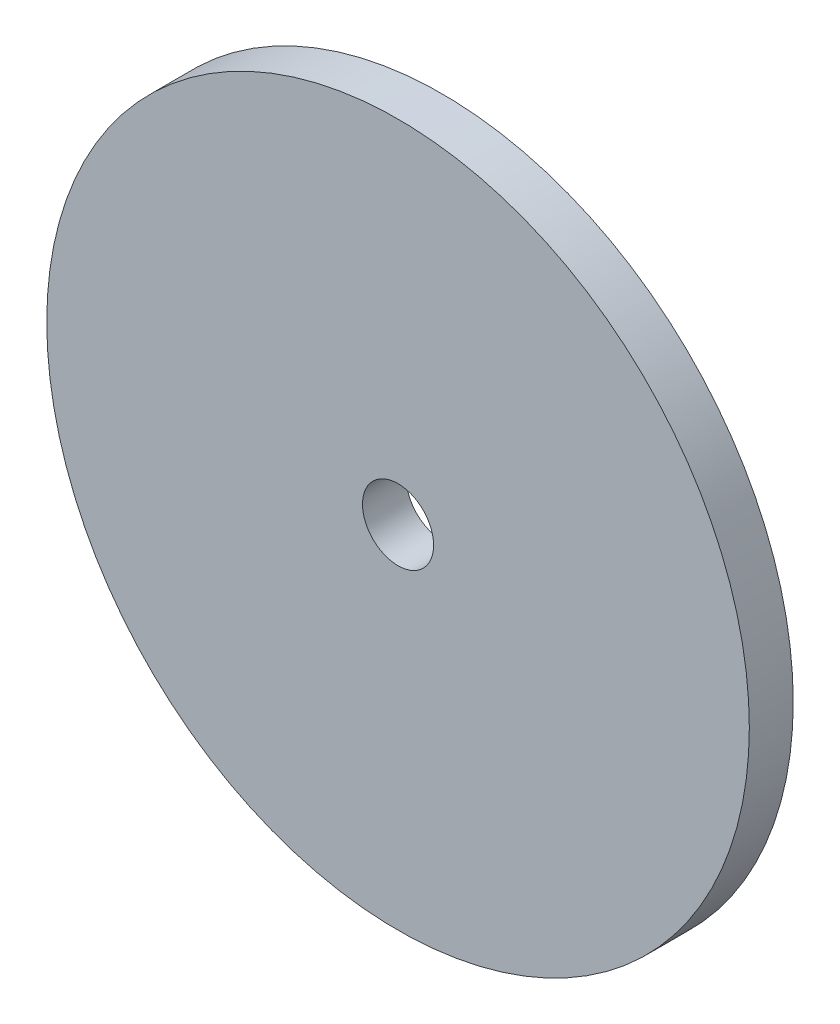
ISO-10303-21;
HEADER;
FILE_DESCRIPTION(('STEP AP214'),'2;1');
FILE_NAME('part.step','',(''),(''),'','','');
FILE_SCHEMA(('AUTOMOTIVE_DESIGN { 1 0 10303 214 1 1 1 1 }'));
ENDSEC;
DATA;
#1=APPLICATION_CONTEXT('core data for automotive mechanical design processes');
#2=APPLICATION_PROTOCOL_DEFINITION('international standard','automotive_design',2000,#1);
#3=PRODUCT_CONTEXT('',#1,'mechanical');
#4=PRODUCT('Part','Part','',(#3));
#5=PRODUCT_RELATED_PRODUCT_CATEGORY('part','',(#4));
#6=PRODUCT_DEFINITION_FORMATION('','',#4);
#7=PRODUCT_DEFINITION_CONTEXT('part definition',#1,'design');
#8=PRODUCT_DEFINITION('design','',#6,#7);
#9=PRODUCT_DEFINITION_SHAPE('','',#8);
#10=(LENGTH_UNIT() NAMED_UNIT(*) SI_UNIT(.MILLI.,.METRE.));
#11=(NAMED_UNIT(*) PLANE_ANGLE_UNIT() SI_UNIT($,.RADIAN.));
#12=(NAMED_UNIT(*) SI_UNIT($,.STERADIAN.) SOLID_ANGLE_UNIT());
#13=UNCERTAINTY_MEASURE_WITH_UNIT(LENGTH_MEASURE(1.E-05),#10,'distance_accuracy_value','');
#14=(GEOMETRIC_REPRESENTATION_CONTEXT(3) GLOBAL_UNCERTAINTY_ASSIGNED_CONTEXT((#13)) GLOBAL_UNIT_ASSIGNED_CONTEXT((#10,
#11,#12)) REPRESENTATION_CONTEXT('',''));
#15=CARTESIAN_POINT('',(0.,0.,0.));
#16=DIRECTION('',(0.,0.,1.));
#17=DIRECTION('',(1.,0.,0.));
#18=AXIS2_PLACEMENT_3D('',#15,#16,#17);
#19=CARTESIAN_POINT('',(0.,0.,5.));
#20=DIRECTION('',(0.,0.,1.));
#21=DIRECTION('',(1.,0.,0.));
#22=AXIS2_PLACEMENT_3D('',#19,#20,#21);
#23=PLANE('',#22);
#24=CARTESIAN_POINT('',(0.,0.,5.));
#25=DIRECTION('',(0.,0.,1.));
#26=DIRECTION('',(1.,0.,0.));
#27=AXIS2_PLACEMENT_3D('',#24,#25,#26);
#28=CIRCLE('',#27,40.);
#29=CARTESIAN_POINT('',(40.,0.,5.));
#30=VERTEX_POINT('',#29);
#31=EDGE_CURVE('E10',#30,#30,#28,.T.);
#32=ORIENTED_EDGE('',*,*,#31,.T.);
#33=EDGE_LOOP('',(#32));
#34=FACE_BOUND('',#33,.T.);
#35=CARTESIAN_POINT('',(0.,0.,5.));
#36=DIRECTION('',(0.,0.,1.));
#37=DIRECTION('',(1.,0.,0.));
#38=AXIS2_PLACEMENT_3D('',#35,#36,#37);
#39=CIRCLE('',#38,4.05);
#40=CARTESIAN_POINT('',(4.05,0.,5.));
#41=VERTEX_POINT('',#40);
#42=EDGE_CURVE('E46',#41,#41,#39,.T.);
#43=ORIENTED_EDGE('',*,*,#42,.F.);
#44=EDGE_LOOP('',(#43));
#45=FACE_BOUND('',#44,.T.);
#46=ADVANCED_FACE('F35',(#34,#45),#23,.T.);
#47=CARTESIAN_POINT('',(0.,0.,0.));
#48=DIRECTION('',(0.,0.,1.));
#49=DIRECTION('',(1.,0.,0.));
#50=AXIS2_PLACEMENT_3D('',#47,#48,#49);
#51=PLANE('',#50);
#52=CARTESIAN_POINT('',(0.,0.,0.));
#53=DIRECTION('',(0.,0.,1.));
#54=DIRECTION('',(1.,0.,0.));
#55=AXIS2_PLACEMENT_3D('',#52,#53,#54);
#56=CIRCLE('',#55,40.);
#57=CARTESIAN_POINT('',(40.,0.,0.));
#58=VERTEX_POINT('',#57);
#59=EDGE_CURVE('E39',#58,#58,#56,.T.);
#60=ORIENTED_EDGE('',*,*,#59,.F.);
#61=EDGE_LOOP('',(#60));
#62=FACE_BOUND('',#61,.T.);
#63=CARTESIAN_POINT('',(0.,0.,0.));
#64=DIRECTION('',(0.,0.,1.));
#65=DIRECTION('',(1.,0.,0.));
#66=AXIS2_PLACEMENT_3D('',#63,#64,#65);
#67=CIRCLE('',#66,4.05);
#68=CARTESIAN_POINT('',(4.05,0.,0.));
#69=VERTEX_POINT('',#68);
#70=EDGE_CURVE('E48',#69,#69,#67,.T.);
#71=ORIENTED_EDGE('',*,*,#70,.T.);
#72=EDGE_LOOP('',(#71));
#73=FACE_BOUND('',#72,.T.);
#74=ADVANCED_FACE('F58',(#62,#73),#51,.F.);
#75=CARTESIAN_POINT('',(0.,0.,5.));
#76=DIRECTION('',(0.,0.,-1.));
#77=DIRECTION('',(-1.,0.,0.));
#78=AXIS2_PLACEMENT_3D('',#75,#76,#77);
#79=CYLINDRICAL_SURFACE('',#78,40.);
#80=ORIENTED_EDGE('',*,*,#31,.F.);
#81=EDGE_LOOP('',(#80));
#82=FACE_BOUND('',#81,.T.);
#83=ORIENTED_EDGE('',*,*,#59,.T.);
#84=EDGE_LOOP('',(#83));
#85=FACE_BOUND('',#84,.T.);
#86=ADVANCED_FACE('F37',(#82,#85),#79,.T.);
#87=CARTESIAN_POINT('',(0.,0.,5.));
#88=DIRECTION('',(0.,0.,-1.));
#89=DIRECTION('',(-1.,0.,0.));
#90=AXIS2_PLACEMENT_3D('',#87,#88,#89);
#91=CYLINDRICAL_SURFACE('',#90,4.05);
#92=ORIENTED_EDGE('',*,*,#42,.T.);
#93=EDGE_LOOP('',(#92));
#94=FACE_BOUND('',#93,.T.);
#95=ORIENTED_EDGE('',*,*,#70,.F.);
#96=EDGE_LOOP('',(#95));
#97=FACE_BOUND('',#96,.T.);
#98=ADVANCED_FACE('F54',(#94,#97),#91,.F.);
#99=CLOSED_SHELL('',(#46,#74,#86,#98));
#100=MANIFOLD_SOLID_BREP('B2',#99);
#101=ADVANCED_BREP_SHAPE_REPRESENTATION('',(#18,#100),#14);
#102=SHAPE_DEFINITION_REPRESENTATION(#9,#101);
ENDSEC;
END-ISO-10303-21;
